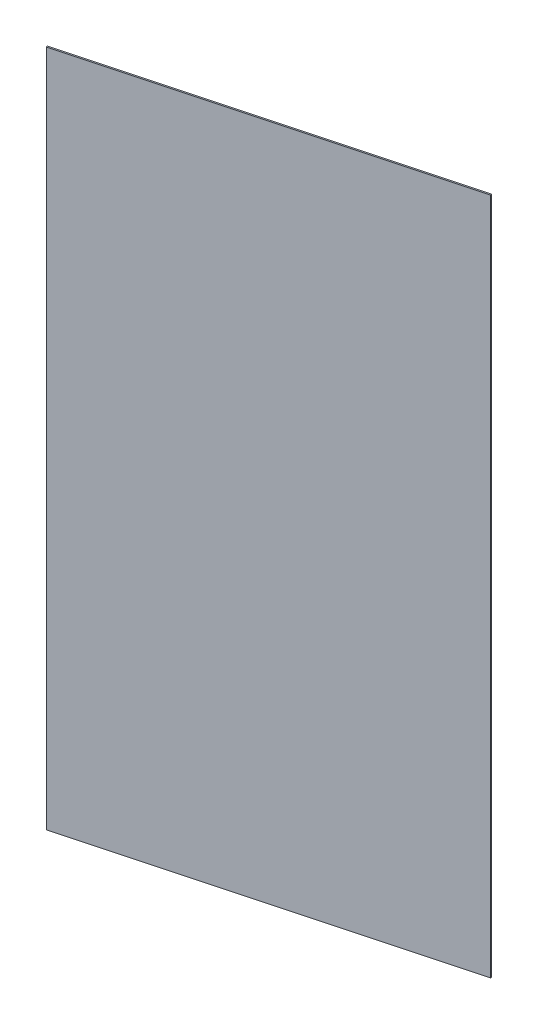
ISO-10303-21;
HEADER;
FILE_DESCRIPTION(('STEP AP214'),'2;1');
FILE_NAME('part.step','',(''),(''),'','','');
FILE_SCHEMA(('AUTOMOTIVE_DESIGN { 1 0 10303 214 1 1 1 1 }'));
ENDSEC;
DATA;
#1=APPLICATION_CONTEXT('core data for automotive mechanical design processes');
#2=APPLICATION_PROTOCOL_DEFINITION('international standard','automotive_design',2000,#1);
#3=PRODUCT_CONTEXT('',#1,'mechanical');
#4=PRODUCT('Part','Part','',(#3));
#5=PRODUCT_RELATED_PRODUCT_CATEGORY('part','',(#4));
#6=PRODUCT_DEFINITION_FORMATION('','',#4);
#7=PRODUCT_DEFINITION_CONTEXT('part definition',#1,'design');
#8=PRODUCT_DEFINITION('design','',#6,#7);
#9=PRODUCT_DEFINITION_SHAPE('','',#8);
#10=(LENGTH_UNIT() NAMED_UNIT(*) SI_UNIT(.MILLI.,.METRE.));
#11=(NAMED_UNIT(*) PLANE_ANGLE_UNIT() SI_UNIT($,.RADIAN.));
#12=(NAMED_UNIT(*) SI_UNIT($,.STERADIAN.) SOLID_ANGLE_UNIT());
#13=UNCERTAINTY_MEASURE_WITH_UNIT(LENGTH_MEASURE(1.E-05),#10,'distance_accuracy_value','');
#14=(GEOMETRIC_REPRESENTATION_CONTEXT(3) GLOBAL_UNCERTAINTY_ASSIGNED_CONTEXT((#13)) GLOBAL_UNIT_ASSIGNED_CONTEXT((#10,
#11,#12)) REPRESENTATION_CONTEXT('',''));
#15=CARTESIAN_POINT('',(0.,0.,0.));
#16=DIRECTION('',(0.,0.,1.));
#17=DIRECTION('',(1.,0.,0.));
#18=AXIS2_PLACEMENT_3D('',#15,#16,#17);
#19=CARTESIAN_POINT('',(-1235.012320885,-2364.,3103.152171008));
#20=DIRECTION('',(0.258819045102985,0.,0.965925826288944));
#21=DIRECTION('',(0.,-1.,0.));
#22=AXIS2_PLACEMENT_3D('',#19,#20,#21);
#23=PLANE('',#22);
#24=DIRECTION('',(0.,1.,0.));
#25=VECTOR('',#24,1.);
#26=CARTESIAN_POINT('',(-1235.012320885,-2364.,3103.152171008));
#27=LINE('',#26,#25);
#28=CARTESIAN_POINT('',(-1235.012320885,-2364.,3103.152171008));
#29=VERTEX_POINT('',#28);
#30=CARTESIAN_POINT('',(-1235.012320885,-40.,3103.152171008));
#31=VERTEX_POINT('',#30);
#32=EDGE_CURVE('E88',#29,#31,#27,.T.);
#33=ORIENTED_EDGE('',*,*,#32,.F.);
#34=DIRECTION('',(0.965925826288944,0.,-0.258819045102985));
#35=VECTOR('',#34,1.);
#36=CARTESIAN_POINT('',(-1235.012320885,-2364.,3103.152171008));
#37=LINE('',#36,#35);
#38=CARTESIAN_POINT('',(-34.36651880737,-2364.,2781.440097945));
#39=VERTEX_POINT('',#38);
#40=EDGE_CURVE('E70',#29,#39,#37,.T.);
#41=ORIENTED_EDGE('',*,*,#40,.T.);
#42=DIRECTION('',(0.,1.,0.));
#43=VECTOR('',#42,1.);
#44=CARTESIAN_POINT('',(-34.36651880737,-2364.,2781.440097945));
#45=LINE('',#44,#43);
#46=CARTESIAN_POINT('',(-34.36651880737,-40.,2781.440097945));
#47=VERTEX_POINT('',#46);
#48=EDGE_CURVE('E82',#39,#47,#45,.T.);
#49=ORIENTED_EDGE('',*,*,#48,.T.);
#50=DIRECTION('',(0.965925826288944,0.,-0.258819045102985));
#51=VECTOR('',#50,1.);
#52=CARTESIAN_POINT('',(-1235.012320885,-40.,3103.152171008));
#53=LINE('',#52,#51);
#54=EDGE_CURVE('E11',#31,#47,#53,.T.);
#55=ORIENTED_EDGE('',*,*,#54,.F.);
#56=EDGE_LOOP('',(#33,#41,#49,#55));
#57=FACE_BOUND('',#56,.T.);
#58=ADVANCED_FACE('F17',(#57),#23,.T.);
#59=CARTESIAN_POINT('',(-1236.30641611,-2364.,3098.322541876));
#60=DIRECTION('',(0.258819045102985,0.,0.965925826288944));
#61=DIRECTION('',(0.,-1.,0.));
#62=AXIS2_PLACEMENT_3D('',#59,#60,#61);
#63=PLANE('',#62);
#64=DIRECTION('',(0.965925826288944,0.,-0.258819045102985));
#65=VECTOR('',#64,1.);
#66=CARTESIAN_POINT('',(-1236.30641611,-40.,3098.322541876));
#67=LINE('',#66,#65);
#68=CARTESIAN_POINT('',(-1236.30641611,-40.,3098.322541876));
#69=VERTEX_POINT('',#68);
#70=CARTESIAN_POINT('',(-35.66061403288,-40.,2776.610468814));
#71=VERTEX_POINT('',#70);
#72=EDGE_CURVE('E25',#69,#71,#67,.T.);
#73=ORIENTED_EDGE('',*,*,#72,.T.);
#74=DIRECTION('',(0.,1.,0.));
#75=VECTOR('',#74,1.);
#76=CARTESIAN_POINT('',(-35.66061403288,-2364.,2776.610468814));
#77=LINE('',#76,#75);
#78=CARTESIAN_POINT('',(-35.66061403288,-2364.,2776.610468814));
#79=VERTEX_POINT('',#78);
#80=EDGE_CURVE('E109',#79,#71,#77,.T.);
#81=ORIENTED_EDGE('',*,*,#80,.F.);
#82=DIRECTION('',(0.965925826288944,0.,-0.258819045102985));
#83=VECTOR('',#82,1.);
#84=CARTESIAN_POINT('',(-1236.30641611,-2364.,3098.322541876));
#85=LINE('',#84,#83);
#86=CARTESIAN_POINT('',(-1236.30641611,-2364.,3098.322541876));
#87=VERTEX_POINT('',#86);
#88=EDGE_CURVE('E81',#87,#79,#85,.T.);
#89=ORIENTED_EDGE('',*,*,#88,.F.);
#90=DIRECTION('',(0.,1.,0.));
#91=VECTOR('',#90,1.);
#92=CARTESIAN_POINT('',(-1236.30641611,-2364.,3098.322541876));
#93=LINE('',#92,#91);
#94=EDGE_CURVE('E89',#87,#69,#93,.T.);
#95=ORIENTED_EDGE('',*,*,#94,.T.);
#96=EDGE_LOOP('',(#73,#81,#89,#95));
#97=FACE_BOUND('',#96,.T.);
#98=ADVANCED_FACE('F122',(#97),#63,.F.);
#99=CARTESIAN_POINT('',(-1236.30641611,-40.,3098.322541876));
#100=DIRECTION('',(0.,1.,0.));
#101=DIRECTION('',(1.,0.,0.));
#102=AXIS2_PLACEMENT_3D('',#99,#100,#101);
#103=PLANE('',#102);
#104=ORIENTED_EDGE('',*,*,#72,.F.);
#105=DIRECTION('',(0.258819045102985,0.,0.965925826288944));
#106=VECTOR('',#105,1.);
#107=CARTESIAN_POINT('',(-1236.30641611,-40.,3098.322541876));
#108=LINE('',#107,#106);
#109=EDGE_CURVE('E93',#69,#31,#108,.T.);
#110=ORIENTED_EDGE('',*,*,#109,.T.);
#111=ORIENTED_EDGE('',*,*,#54,.T.);
#112=DIRECTION('',(0.258819045102985,0.,0.965925826288944));
#113=VECTOR('',#112,1.);
#114=CARTESIAN_POINT('',(-35.66061403288,-40.,2776.610468814));
#115=LINE('',#114,#113);
#116=EDGE_CURVE('E113',#71,#47,#115,.T.);
#117=ORIENTED_EDGE('',*,*,#116,.F.);
#118=EDGE_LOOP('',(#104,#110,#111,#117));
#119=FACE_BOUND('',#118,.T.);
#120=ADVANCED_FACE('F121',(#119),#103,.T.);
#121=CARTESIAN_POINT('',(-1236.30641611,-2364.,3098.322541876));
#122=DIRECTION('',(0.,1.,0.));
#123=DIRECTION('',(1.,0.,0.));
#124=AXIS2_PLACEMENT_3D('',#121,#122,#123);
#125=PLANE('',#124);
#126=DIRECTION('',(0.258819045102985,0.,0.965925826288944));
#127=VECTOR('',#126,1.);
#128=CARTESIAN_POINT('',(-35.66061403288,-2364.,2776.610468814));
#129=LINE('',#128,#127);
#130=EDGE_CURVE('E76',#79,#39,#129,.T.);
#131=ORIENTED_EDGE('',*,*,#130,.T.);
#132=ORIENTED_EDGE('',*,*,#40,.F.);
#133=DIRECTION('',(0.258819045102985,0.,0.965925826288944));
#134=VECTOR('',#133,1.);
#135=CARTESIAN_POINT('',(-1236.30641611,-2364.,3098.322541876));
#136=LINE('',#135,#134);
#137=EDGE_CURVE('E73',#87,#29,#136,.T.);
#138=ORIENTED_EDGE('',*,*,#137,.F.);
#139=ORIENTED_EDGE('',*,*,#88,.T.);
#140=EDGE_LOOP('',(#131,#132,#138,#139));
#141=FACE_BOUND('',#140,.T.);
#142=ADVANCED_FACE('F72',(#141),#125,.F.);
#143=CARTESIAN_POINT('',(-35.66061403288,-2364.,2776.610468814));
#144=DIRECTION('',(0.965925826288944,0.,-0.258819045102985));
#145=DIRECTION('',(0.,-1.,0.));
#146=AXIS2_PLACEMENT_3D('',#143,#144,#145);
#147=PLANE('',#146);
#148=ORIENTED_EDGE('',*,*,#130,.F.);
#149=ORIENTED_EDGE('',*,*,#80,.T.);
#150=ORIENTED_EDGE('',*,*,#116,.T.);
#151=ORIENTED_EDGE('',*,*,#48,.F.);
#152=EDGE_LOOP('',(#148,#149,#150,#151));
#153=FACE_BOUND('',#152,.T.);
#154=ADVANCED_FACE('F120',(#153),#147,.T.);
#155=CARTESIAN_POINT('',(-1236.30641611,-2364.,3098.322541876));
#156=DIRECTION('',(0.965925826288944,0.,-0.258819045102985));
#157=DIRECTION('',(0.,-1.,0.));
#158=AXIS2_PLACEMENT_3D('',#155,#156,#157);
#159=PLANE('',#158);
#160=ORIENTED_EDGE('',*,*,#32,.T.);
#161=ORIENTED_EDGE('',*,*,#109,.F.);
#162=ORIENTED_EDGE('',*,*,#94,.F.);
#163=ORIENTED_EDGE('',*,*,#137,.T.);
#164=EDGE_LOOP('',(#160,#161,#162,#163));
#165=FACE_BOUND('',#164,.T.);
#166=ADVANCED_FACE('F86',(#165),#159,.F.);
#167=CLOSED_SHELL('',(#58,#98,#120,#142,#154,#166));
#168=MANIFOLD_SOLID_BREP('B1',#167);
#169=ADVANCED_BREP_SHAPE_REPRESENTATION('',(#18,#168),#14);
#170=SHAPE_DEFINITION_REPRESENTATION(#9,#169);
ENDSEC;
END-ISO-10303-21;
